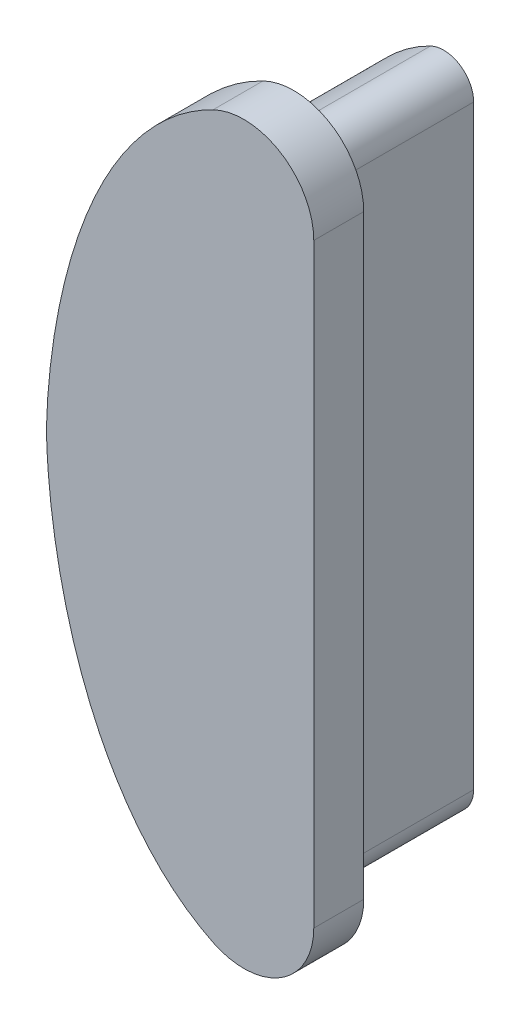
ISO-10303-21;
HEADER;
FILE_DESCRIPTION(('STEP AP214'),'2;1');
FILE_NAME('part.step','',(''),(''),'','','');
FILE_SCHEMA(('AUTOMOTIVE_DESIGN { 1 0 10303 214 1 1 1 1 }'));
ENDSEC;
DATA;
#1=APPLICATION_CONTEXT('core data for automotive mechanical design processes');
#2=APPLICATION_PROTOCOL_DEFINITION('international standard','automotive_design',2000,#1);
#3=PRODUCT_CONTEXT('',#1,'mechanical');
#4=PRODUCT('Part','Part','',(#3));
#5=PRODUCT_RELATED_PRODUCT_CATEGORY('part','',(#4));
#6=PRODUCT_DEFINITION_FORMATION('','',#4);
#7=PRODUCT_DEFINITION_CONTEXT('part definition',#1,'design');
#8=PRODUCT_DEFINITION('design','',#6,#7);
#9=PRODUCT_DEFINITION_SHAPE('','',#8);
#10=(LENGTH_UNIT() NAMED_UNIT(*) SI_UNIT(.MILLI.,.METRE.));
#11=(NAMED_UNIT(*) PLANE_ANGLE_UNIT() SI_UNIT($,.RADIAN.));
#12=(NAMED_UNIT(*) SI_UNIT($,.STERADIAN.) SOLID_ANGLE_UNIT());
#13=UNCERTAINTY_MEASURE_WITH_UNIT(LENGTH_MEASURE(1.E-05),#10,'distance_accuracy_value','');
#14=(GEOMETRIC_REPRESENTATION_CONTEXT(3) GLOBAL_UNCERTAINTY_ASSIGNED_CONTEXT((#13)) GLOBAL_UNIT_ASSIGNED_CONTEXT((#10,
#11,#12)) REPRESENTATION_CONTEXT('',''));
#15=CARTESIAN_POINT('',(0.,0.,0.));
#16=DIRECTION('',(0.,0.,1.));
#17=DIRECTION('',(1.,0.,0.));
#18=AXIS2_PLACEMENT_3D('',#15,#16,#17);
#19=CARTESIAN_POINT('',(-0.938912210717622,-0.460628890981681,3.));
#20=CARTESIAN_POINT('',(-0.930215869974185,-0.813566246949149,3.));
#21=CARTESIAN_POINT('',(-0.882193888673177,-1.50312367914859,3.));
#22=CARTESIAN_POINT('',(-0.647319625173885,-2.99460093175038,3.));
#23=CARTESIAN_POINT('',(-0.0808522255297091,-4.82009209464893,3.));
#24=CARTESIAN_POINT('',(0.89008132531581,-6.26366669180822,3.));
#25=CARTESIAN_POINT('',(1.89349715611541,-6.98605857077607,3.));
#26=CARTESIAN_POINT('',(2.50471800411417,-7.18566243001422,3.));
#27=CARTESIAN_POINT('',(2.81372610105993,-7.2337228856336,3.));
#28=B_SPLINE_CURVE_WITH_KNOTS('',3,(#19,#20,#21,#22,#23,#24,#25,#26,#27),.UNSPECIFIED.,.F.,.F.,
(4,1,1,1,1,1,4),(0.0326750747868868,0.153501113051904,0.274327151316921,0.515979227846955,
0.757631304376989,0.878457342642006,0.999283380907024),.UNSPECIFIED.);
#29=DIRECTION('',(0.,0.,-1.));
#30=VECTOR('',#29,1.);
#31=SURFACE_OF_LINEAR_EXTRUSION('',#28,#30);
#32=CARTESIAN_POINT('',(-0.938912210717622,-0.460628890981681,0.));
#33=CARTESIAN_POINT('',(-0.930215869974185,-0.813566246949149,0.));
#34=CARTESIAN_POINT('',(-0.882193888673177,-1.50312367914859,0.));
#35=CARTESIAN_POINT('',(-0.647319625173885,-2.99460093175038,0.));
#36=CARTESIAN_POINT('',(-0.0808522255297091,-4.82009209464893,0.));
#37=CARTESIAN_POINT('',(0.89008132531581,-6.26366669180822,0.));
#38=CARTESIAN_POINT('',(1.89349715611541,-6.98605857077607,0.));
#39=CARTESIAN_POINT('',(2.50471800411417,-7.18566243001422,0.));
#40=CARTESIAN_POINT('',(2.81372610105993,-7.2337228856336,0.));
#41=B_SPLINE_CURVE_WITH_KNOTS('',3,(#32,#33,#34,#35,#36,#37,#38,#39,#40),.UNSPECIFIED.,.F.,.F.,
(4,1,1,1,1,1,4),(0.0326750747868868,0.153501113051904,0.274327151316921,0.515979227846955,
0.757631304376989,0.878457342642006,0.999283380907024),.UNSPECIFIED.);
#42=CARTESIAN_POINT('',(-0.938912210717622,-0.460628890981681,0.));
#43=VERTEX_POINT('',#42);
#44=CARTESIAN_POINT('',(1.94940692939656,-6.95984878869573,0.));
#45=VERTEX_POINT('',#44);
#46=EDGE_CURVE('E146',#43,#45,#41,.T.);
#47=ORIENTED_EDGE('',*,*,#46,.T.);
#48=DIRECTION('',(0.,0.,-1.));
#49=VECTOR('',#48,1.);
#50=CARTESIAN_POINT('',(1.94940692939656,-6.95984878869573,0.));
#51=LINE('',#50,#49);
#52=CARTESIAN_POINT('',(1.94940692939656,-6.95984878869573,3.));
#53=VERTEX_POINT('',#52);
#54=EDGE_CURVE('E57',#45,#53,#51,.F.);
#55=ORIENTED_EDGE('',*,*,#54,.T.);
#56=CARTESIAN_POINT('',(-0.938912210717622,-0.460628890981681,3.));
#57=VERTEX_POINT('',#56);
#58=EDGE_CURVE('E265',#57,#53,#28,.T.);
#59=ORIENTED_EDGE('',*,*,#58,.F.);
#60=DIRECTION('',(0.,0.,-1.));
#61=VECTOR('',#60,1.);
#62=CARTESIAN_POINT('',(-0.938912210717622,-0.460628890981681,3.));
#63=LINE('',#62,#61);
#64=EDGE_CURVE('E302',#57,#43,#63,.T.);
#65=ORIENTED_EDGE('',*,*,#64,.T.);
#66=EDGE_LOOP('',(#47,#55,#59,#65));
#67=FACE_BOUND('',#66,.T.);
#68=ADVANCED_FACE('F35',(#67),#31,.F.);
#69=CARTESIAN_POINT('',(2.81372610105993,-7.2337228856336,3.));
#70=DIRECTION('',(-1.,0.,0.));
#71=DIRECTION('',(0.,0.,1.));
#72=AXIS2_PLACEMENT_3D('',#69,#70,#71);
#73=PLANE('',#72);
#74=DIRECTION('',(0.,1.,0.));
#75=VECTOR('',#74,1.);
#76=CARTESIAN_POINT('',(2.81372610105993,-7.2337228856336,3.));
#77=LINE('',#76,#75);
#78=CARTESIAN_POINT('',(2.81372610105993,-6.42120662965955,3.));
#79=VERTEX_POINT('',#78);
#80=CARTESIAN_POINT('',(2.81372610105993,5.49994884769618,3.));
#81=VERTEX_POINT('',#80);
#82=EDGE_CURVE('E271',#79,#81,#77,.T.);
#83=ORIENTED_EDGE('',*,*,#82,.F.);
#84=DIRECTION('',(0.,0.,-1.));
#85=VECTOR('',#84,1.);
#86=CARTESIAN_POINT('',(2.81372610105993,-6.42120662965955,3.));
#87=LINE('',#86,#85);
#88=CARTESIAN_POINT('',(2.81372610105993,-6.42120662965955,0.));
#89=VERTEX_POINT('',#88);
#90=EDGE_CURVE('E296',#79,#89,#87,.T.);
#91=ORIENTED_EDGE('',*,*,#90,.T.);
#92=DIRECTION('',(0.,1.,0.));
#93=VECTOR('',#92,1.);
#94=CARTESIAN_POINT('',(2.81372610105993,-7.2337228856336,0.));
#95=LINE('',#94,#93);
#96=CARTESIAN_POINT('',(2.81372610105993,5.49994884769618,0.));
#97=VERTEX_POINT('',#96);
#98=EDGE_CURVE('E148',#89,#97,#95,.T.);
#99=ORIENTED_EDGE('',*,*,#98,.T.);
#100=DIRECTION('',(0.,0.,-1.));
#101=VECTOR('',#100,1.);
#102=CARTESIAN_POINT('',(2.81372610105993,5.49994884769618,3.));
#103=LINE('',#102,#101);
#104=EDGE_CURVE('E305',#97,#81,#103,.F.);
#105=ORIENTED_EDGE('',*,*,#104,.T.);
#106=EDGE_LOOP('',(#83,#91,#99,#105));
#107=FACE_BOUND('',#106,.T.);
#108=ADVANCED_FACE('F280',(#107),#73,.F.);
#109=CARTESIAN_POINT('',(2.81372610105993,6.31246510367024,3.));
#110=CARTESIAN_POINT('',(2.50471800411417,6.26440464805085,3.));
#111=CARTESIAN_POINT('',(1.89349715611541,6.0648007888127,3.));
#112=CARTESIAN_POINT('',(0.89008132531581,5.34240890984486,3.));
#113=CARTESIAN_POINT('',(-0.080852225529709,3.89883431268557,3.));
#114=CARTESIAN_POINT('',(-0.647319625173885,2.07334314978702,3.));
#115=CARTESIAN_POINT('',(-0.882193888673177,0.581865897185233,3.));
#116=CARTESIAN_POINT('',(-0.930215869974185,-0.107691535014213,3.));
#117=CARTESIAN_POINT('',(-0.938912210717622,-0.460628890981681,3.));
#118=B_SPLINE_CURVE_WITH_KNOTS('',3,(#109,#110,#111,#112,#113,#114,#115,#116,#117),
.UNSPECIFIED.,.F.,.F.,(4,1,1,1,1,1,4),(0.0326750747868867,0.153501113051904,0.274327151316921,
0.515979227846955,0.757631304376989,0.878457342642006,0.999283380907024),.UNSPECIFIED.);
#119=DIRECTION('',(0.,0.,-1.));
#120=VECTOR('',#119,1.);
#121=SURFACE_OF_LINEAR_EXTRUSION('',#118,#120);
#122=CARTESIAN_POINT('',(1.9494069293965,6.03859100673233,3.));
#123=VERTEX_POINT('',#122);
#124=EDGE_CURVE('E49',#123,#57,#118,.T.);
#125=ORIENTED_EDGE('',*,*,#124,.F.);
#126=DIRECTION('',(0.,0.,-1.));
#127=VECTOR('',#126,1.);
#128=CARTESIAN_POINT('',(1.9494069293965,6.03859100673233,3.));
#129=LINE('',#128,#127);
#130=CARTESIAN_POINT('',(1.9494069293965,6.03859100673233,0.));
#131=VERTEX_POINT('',#130);
#132=EDGE_CURVE('E11',#123,#131,#129,.T.);
#133=ORIENTED_EDGE('',*,*,#132,.T.);
#134=CARTESIAN_POINT('',(2.81372610105993,6.31246510367024,0.));
#135=CARTESIAN_POINT('',(2.50471800411417,6.26440464805085,0.));
#136=CARTESIAN_POINT('',(1.89349715611541,6.0648007888127,0.));
#137=CARTESIAN_POINT('',(0.89008132531581,5.34240890984486,0.));
#138=CARTESIAN_POINT('',(-0.080852225529709,3.89883431268557,0.));
#139=CARTESIAN_POINT('',(-0.647319625173885,2.07334314978702,0.));
#140=CARTESIAN_POINT('',(-0.882193888673177,0.581865897185233,0.));
#141=CARTESIAN_POINT('',(-0.930215869974185,-0.107691535014213,0.));
#142=CARTESIAN_POINT('',(-0.938912210717622,-0.460628890981681,0.));
#143=B_SPLINE_CURVE_WITH_KNOTS('',3,(#134,#135,#136,#137,#138,#139,#140,#141,#142),
.UNSPECIFIED.,.F.,.F.,(4,1,1,1,1,1,4),(0.0326750747868867,0.153501113051904,0.274327151316921,
0.515979227846955,0.757631304376989,0.878457342642006,0.999283380907024),.UNSPECIFIED.);
#144=EDGE_CURVE('E272',#131,#43,#143,.T.);
#145=ORIENTED_EDGE('',*,*,#144,.T.);
#146=ORIENTED_EDGE('',*,*,#64,.F.);
#147=EDGE_LOOP('',(#125,#133,#145,#146));
#148=FACE_BOUND('',#147,.T.);
#149=ADVANCED_FACE('F291',(#148),#121,.F.);
#150=CARTESIAN_POINT('',(4.10047105600136E-05,-4.74370878150108,0.));
#151=DIRECTION('',(0.,0.,-1.));
#152=DIRECTION('',(-1.,0.,0.));
#153=AXIS2_PLACEMENT_3D('',#150,#151,#152);
#154=PLANE('',#153);
#155=ORIENTED_EDGE('',*,*,#98,.F.);
#156=CARTESIAN_POINT('',(2.21372610106005,-6.42120662965955,0.));
#157=DIRECTION('',(0.,0.,-1.));
#158=DIRECTION('',(-1.,0.,0.));
#159=AXIS2_PLACEMENT_3D('',#156,#157,#158);
#160=CIRCLE('',#159,0.6);
#161=EDGE_CURVE('E316',#89,#45,#160,.T.);
#162=ORIENTED_EDGE('',*,*,#161,.T.);
#163=ORIENTED_EDGE('',*,*,#46,.F.);
#164=ORIENTED_EDGE('',*,*,#144,.F.);
#165=CARTESIAN_POINT('',(2.21372610105999,5.49994884769618,0.));
#166=DIRECTION('',(0.,0.,-1.));
#167=DIRECTION('',(-1.,0.,0.));
#168=AXIS2_PLACEMENT_3D('',#165,#166,#167);
#169=CIRCLE('',#168,0.6);
#170=EDGE_CURVE('E314',#131,#97,#169,.T.);
#171=ORIENTED_EDGE('',*,*,#170,.T.);
#172=EDGE_LOOP('',(#155,#162,#163,#164,#171));
#173=FACE_BOUND('',#172,.T.);
#174=ADVANCED_FACE('F284',(#173),#154,.T.);
#175=CARTESIAN_POINT('',(2.21372610106005,-6.42120662965955,1.5));
#176=DIRECTION('',(0.,0.,-1.));
#177=DIRECTION('',(-1.,0.,0.));
#178=AXIS2_PLACEMENT_3D('',#175,#176,#177);
#179=CYLINDRICAL_SURFACE('',#178,0.6);
#180=CARTESIAN_POINT('',(2.21372610106005,-6.42120662965955,3.));
#181=DIRECTION('',(0.,0.,-1.));
#182=DIRECTION('',(-1.,0.,0.));
#183=AXIS2_PLACEMENT_3D('',#180,#181,#182);
#184=CIRCLE('',#183,0.6);
#185=EDGE_CURVE('E43',#53,#79,#184,.F.);
#186=ORIENTED_EDGE('',*,*,#185,.F.);
#187=ORIENTED_EDGE('',*,*,#54,.F.);
#188=ORIENTED_EDGE('',*,*,#161,.F.);
#189=ORIENTED_EDGE('',*,*,#90,.F.);
#190=EDGE_LOOP('',(#186,#187,#188,#189));
#191=FACE_BOUND('',#190,.T.);
#192=ADVANCED_FACE('F282',(#191),#179,.T.);
#193=CARTESIAN_POINT('',(2.21372610105999,5.49994884769618,1.5));
#194=DIRECTION('',(0.,0.,-1.));
#195=DIRECTION('',(-1.,0.,0.));
#196=AXIS2_PLACEMENT_3D('',#193,#194,#195);
#197=CYLINDRICAL_SURFACE('',#196,0.6);
#198=CARTESIAN_POINT('',(2.21372610105999,5.49994884769618,3.));
#199=DIRECTION('',(0.,0.,-1.));
#200=DIRECTION('',(-1.,0.,0.));
#201=AXIS2_PLACEMENT_3D('',#198,#199,#200);
#202=CIRCLE('',#201,0.6);
#203=EDGE_CURVE('E299',#81,#123,#202,.F.);
#204=ORIENTED_EDGE('',*,*,#203,.F.);
#205=ORIENTED_EDGE('',*,*,#104,.F.);
#206=ORIENTED_EDGE('',*,*,#170,.F.);
#207=ORIENTED_EDGE('',*,*,#132,.F.);
#208=EDGE_LOOP('',(#204,#205,#206,#207));
#209=FACE_BOUND('',#208,.T.);
#210=ADVANCED_FACE('F37',(#209),#197,.T.);
#211=CARTESIAN_POINT('',(1.59698136717853,6.75678055211384,4.));
#212=CARTESIAN_POINT('',(1.28206176202311,6.60224513787106,4.));
#213=CARTESIAN_POINT('',(0.994843741393202,6.40713564544012,4.));
#214=CARTESIAN_POINT('',(0.467503364348097,5.94793637678211,4.));
#215=CARTESIAN_POINT('',(0.233787218104545,5.69040011793546,4.));
#216=CARTESIAN_POINT('',(-0.184066223507001,5.14061817776625,4.));
#217=CARTESIAN_POINT('',(-0.370152573976016,4.84527014812926,4.));
#218=CARTESIAN_POINT('',(-0.699300989325908,4.23283337494818,4.));
#219=CARTESIAN_POINT('',(-0.841194277304251,3.91834030463301,4.));
#220=CARTESIAN_POINT('',(-1.08985728586109,3.27654002703633,4.));
#221=CARTESIAN_POINT('',(-1.19661075310595,2.9492268900484,4.));
#222=CARTESIAN_POINT('',(-1.38071085024028,2.28387211468403,4.));
#223=CARTESIAN_POINT('',(-1.45816317854415,1.9447137117851,4.));
#224=CARTESIAN_POINT('',(-1.64874703473297,0.922143409252922,4.));
#225=CARTESIAN_POINT('',(-1.72203755798871,0.234076304266433,4.));
#226=CARTESIAN_POINT('',(-1.73915502371447,-0.460628890981681,4.));
#227=B_SPLINE_CURVE_WITH_KNOTS('',3,(#211,#212,#213,#214,#215,#216,#217,#218,#219,#220,#221,
#222,#223,#224,#225,#226),.UNSPECIFIED.,.F.,.F.,(4,2,2,2,2,2,2,4),(0.,0.125,0.25,0.375,0.5,
0.625,0.75,1.),.UNSPECIFIED.);
#228=DIRECTION('',(0.,0.,-1.));
#229=VECTOR('',#228,1.);
#230=SURFACE_OF_LINEAR_EXTRUSION('',#227,#229);
#231=CARTESIAN_POINT('',(1.59698136717853,6.75678055211384,3.));
#232=CARTESIAN_POINT('',(1.28206176202311,6.60224513787106,3.));
#233=CARTESIAN_POINT('',(0.994843741393202,6.40713564544012,3.));
#234=CARTESIAN_POINT('',(0.467503364348097,5.94793637678211,3.));
#235=CARTESIAN_POINT('',(0.233787218104545,5.69040011793546,3.));
#236=CARTESIAN_POINT('',(-0.184066223507001,5.14061817776625,3.));
#237=CARTESIAN_POINT('',(-0.370152573976016,4.84527014812926,3.));
#238=CARTESIAN_POINT('',(-0.699300989325908,4.23283337494818,3.));
#239=CARTESIAN_POINT('',(-0.841194277304251,3.91834030463301,3.));
#240=CARTESIAN_POINT('',(-1.08985728586109,3.27654002703633,3.));
#241=CARTESIAN_POINT('',(-1.19661075310595,2.9492268900484,3.));
#242=CARTESIAN_POINT('',(-1.38071085024028,2.28387211468403,3.));
#243=CARTESIAN_POINT('',(-1.45816317854415,1.9447137117851,3.));
#244=CARTESIAN_POINT('',(-1.64874703473297,0.922143409252922,3.));
#245=CARTESIAN_POINT('',(-1.72203755798871,0.234076304266433,3.));
#246=CARTESIAN_POINT('',(-1.73915502371447,-0.460628890981681,3.));
#247=B_SPLINE_CURVE_WITH_KNOTS('',3,(#231,#232,#233,#234,#235,#236,#237,#238,#239,#240,#241,
#242,#243,#244,#245,#246),.UNSPECIFIED.,.F.,.F.,(4,2,2,2,2,2,2,4),(0.,0.125,0.25,0.375,0.5,
0.625,0.75,1.),.UNSPECIFIED.);
#248=CARTESIAN_POINT('',(1.59698136717853,6.75678055211382,3.));
#249=VERTEX_POINT('',#248);
#250=CARTESIAN_POINT('',(-1.73915502371447,-0.460628890981681,3.));
#251=VERTEX_POINT('',#250);
#252=EDGE_CURVE('E144',#249,#251,#247,.T.);
#253=ORIENTED_EDGE('',*,*,#252,.T.);
#254=DIRECTION('',(0.,0.,-1.));
#255=VECTOR('',#254,1.);
#256=CARTESIAN_POINT('',(-1.73915502371447,-0.460628890981681,4.));
#257=LINE('',#256,#255);
#258=CARTESIAN_POINT('',(-1.73915502371447,-0.460628890981681,4.));
#259=VERTEX_POINT('',#258);
#260=EDGE_CURVE('E119',#259,#251,#257,.T.);
#261=ORIENTED_EDGE('',*,*,#260,.F.);
#262=CARTESIAN_POINT('',(-1.73915502371447,-0.460628890981681,4.));
#263=CARTESIAN_POINT('',(-1.72203755798871,0.234076304266433,4.));
#264=CARTESIAN_POINT('',(-1.64874703473297,0.922143409252922,4.));
#265=CARTESIAN_POINT('',(-1.45816317854415,1.9447137117851,4.));
#266=CARTESIAN_POINT('',(-1.38071085024028,2.28387211468403,4.));
#267=CARTESIAN_POINT('',(-1.19661075310595,2.9492268900484,4.));
#268=CARTESIAN_POINT('',(-1.08985728586109,3.27654002703633,4.));
#269=CARTESIAN_POINT('',(-0.841194277304251,3.91834030463301,4.));
#270=CARTESIAN_POINT('',(-0.699300989325908,4.23283337494818,4.));
#271=CARTESIAN_POINT('',(-0.370152573976016,4.84527014812926,4.));
#272=CARTESIAN_POINT('',(-0.184066223507001,5.14061817776625,4.));
#273=CARTESIAN_POINT('',(0.233787218104545,5.69040011793546,4.));
#274=CARTESIAN_POINT('',(0.467503364348097,5.94793637678211,4.));
#275=CARTESIAN_POINT('',(0.994843741393202,6.40713564544012,4.));
#276=CARTESIAN_POINT('',(1.28206176202311,6.60224513787106,4.));
#277=CARTESIAN_POINT('',(1.59698136717853,6.75678055211384,4.));
#278=B_SPLINE_CURVE_WITH_KNOTS('',3,(#262,#263,#264,#265,#266,#267,#268,#269,#270,#271,#272,
#273,#274,#275,#276,#277),.UNSPECIFIED.,.F.,.F.,(4,2,2,2,2,2,2,4),(0.,0.25,0.375,0.5,0.625,0.75,
0.875,1.),.UNSPECIFIED.);
#279=CARTESIAN_POINT('',(1.59698136717853,6.75678055211382,4.));
#280=VERTEX_POINT('',#279);
#281=EDGE_CURVE('E127',#280,#259,#278,.F.);
#282=ORIENTED_EDGE('',*,*,#281,.F.);
#283=DIRECTION('',(0.,0.,-1.));
#284=VECTOR('',#283,1.);
#285=CARTESIAN_POINT('',(1.59698136717853,6.75678055211382,4.));
#286=LINE('',#285,#284);
#287=EDGE_CURVE('E203',#280,#249,#286,.T.);
#288=ORIENTED_EDGE('',*,*,#287,.T.);
#289=EDGE_LOOP('',(#253,#261,#282,#288));
#290=FACE_BOUND('',#289,.T.);
#291=ADVANCED_FACE('F142',(#290),#230,.F.);
#292=CARTESIAN_POINT('',(-1.73915502371447,-0.460628890981681,4.));
#293=CARTESIAN_POINT('',(-1.72203627169885,-1.15538628976636,4.));
#294=CARTESIAN_POINT('',(-1.64874297364986,-1.84324582986891,4.));
#295=CARTESIAN_POINT('',(-1.45833205683048,-2.86515384294929,4.));
#296=CARTESIAN_POINT('',(-1.38079382697728,-3.20477496342549,4.));
#297=CARTESIAN_POINT('',(-1.19678484278644,-3.86991046658444,4.));
#298=CARTESIAN_POINT('',(-0.983662470004055,-4.52326445701269,4.));
#299=CARTESIAN_POINT('',(-0.701707089934085,-5.14876332679485,4.));
#300=CARTESIAN_POINT('',(-0.375964944438823,-5.75654270876575,4.));
#301=CARTESIAN_POINT('',(-0.189209114177491,-6.05447331207561,4.));
#302=CARTESIAN_POINT('',(0.231167862796688,-6.60883590340507,4.));
#303=CARTESIAN_POINT('',(0.464059519577493,-6.86563861312892,4.));
#304=CARTESIAN_POINT('',(0.858736470779852,-7.21014552949839,4.));
#305=CARTESIAN_POINT('',(0.99817121196507,-7.31798073500881,4.));
#306=CARTESIAN_POINT('',(1.28806801673091,-7.51288995776142,4.));
#307=CARTESIAN_POINT('',(1.43922648706688,-7.60062582832091,4.));
#308=CARTESIAN_POINT('',(1.59698136717855,-7.67803833407725,4.));
#309=B_SPLINE_CURVE_WITH_KNOTS('',3,(#292,#293,#294,#295,#296,#297,#298,#299,#300,#301,#302,
#303,#304,#305,#306,#307,#308),.UNSPECIFIED.,.F.,.F.,(4,2,2,1,2,2,2,2,4),(0.,0.25,0.375,0.5,
0.625,0.75,0.875,0.9375,1.),.UNSPECIFIED.);
#310=DIRECTION('',(0.,0.,-1.));
#311=VECTOR('',#310,1.);
#312=SURFACE_OF_LINEAR_EXTRUSION('',#309,#311);
#313=CARTESIAN_POINT('',(-1.73915502371447,-0.460628890981681,3.));
#314=CARTESIAN_POINT('',(-1.72203627169885,-1.15538628976636,3.));
#315=CARTESIAN_POINT('',(-1.64874297364986,-1.84324582986891,3.));
#316=CARTESIAN_POINT('',(-1.45833205683048,-2.86515384294929,3.));
#317=CARTESIAN_POINT('',(-1.38079382697728,-3.20477496342549,3.));
#318=CARTESIAN_POINT('',(-1.19678484278644,-3.86991046658444,3.));
#319=CARTESIAN_POINT('',(-0.983662470004055,-4.52326445701269,3.));
#320=CARTESIAN_POINT('',(-0.701707089934085,-5.14876332679485,3.));
#321=CARTESIAN_POINT('',(-0.375964944438823,-5.75654270876575,3.));
#322=CARTESIAN_POINT('',(-0.189209114177491,-6.05447331207561,3.));
#323=CARTESIAN_POINT('',(0.231167862796688,-6.60883590340507,3.));
#324=CARTESIAN_POINT('',(0.464059519577493,-6.86563861312892,3.));
#325=CARTESIAN_POINT('',(0.858736470779852,-7.21014552949839,3.));
#326=CARTESIAN_POINT('',(0.99817121196507,-7.31798073500881,3.));
#327=CARTESIAN_POINT('',(1.28806801673091,-7.51288995776142,3.));
#328=CARTESIAN_POINT('',(1.43922648706688,-7.60062582832091,3.));
#329=CARTESIAN_POINT('',(1.59698136717855,-7.67803833407725,3.));
#330=B_SPLINE_CURVE_WITH_KNOTS('',3,(#313,#314,#315,#316,#317,#318,#319,#320,#321,#322,#323,
#324,#325,#326,#327,#328,#329),.UNSPECIFIED.,.F.,.F.,(4,2,2,1,2,2,2,2,4),(0.,0.25,0.375,0.5,
0.625,0.75,0.875,0.9375,1.),.UNSPECIFIED.);
#331=CARTESIAN_POINT('',(1.59698136717855,-7.67803833407725,3.));
#332=VERTEX_POINT('',#331);
#333=EDGE_CURVE('E165',#251,#332,#330,.T.);
#334=ORIENTED_EDGE('',*,*,#333,.T.);
#335=DIRECTION('',(0.,0.,-1.));
#336=VECTOR('',#335,1.);
#337=CARTESIAN_POINT('',(1.59698136717855,-7.67803833407725,4.));
#338=LINE('',#337,#336);
#339=CARTESIAN_POINT('',(1.59698136717855,-7.67803833407725,4.));
#340=VERTEX_POINT('',#339);
#341=EDGE_CURVE('E122',#340,#332,#338,.T.);
#342=ORIENTED_EDGE('',*,*,#341,.F.);
#343=CARTESIAN_POINT('',(1.59698136717855,-7.67803833407725,4.));
#344=CARTESIAN_POINT('',(1.43922648706688,-7.60062582832091,4.));
#345=CARTESIAN_POINT('',(1.28806801673091,-7.51288995776142,4.));
#346=CARTESIAN_POINT('',(0.99817121196507,-7.31798073500881,4.));
#347=CARTESIAN_POINT('',(0.858736470779852,-7.21014552949839,4.));
#348=CARTESIAN_POINT('',(0.464059519577493,-6.86563861312892,4.));
#349=CARTESIAN_POINT('',(0.231167862796688,-6.60883590340507,4.));
#350=CARTESIAN_POINT('',(-0.189209114177491,-6.05447331207561,4.));
#351=CARTESIAN_POINT('',(-0.375964944438823,-5.75654270876575,4.));
#352=CARTESIAN_POINT('',(-0.701707089934085,-5.14876332679485,4.));
#353=CARTESIAN_POINT('',(-0.983662470004055,-4.52326445701269,4.));
#354=CARTESIAN_POINT('',(-1.19678484278644,-3.86991046658444,4.));
#355=CARTESIAN_POINT('',(-1.38079382697728,-3.20477496342549,4.));
#356=CARTESIAN_POINT('',(-1.45833205683048,-2.86515384294929,4.));
#357=CARTESIAN_POINT('',(-1.64874297364986,-1.84324582986891,4.));
#358=CARTESIAN_POINT('',(-1.72203627169885,-1.15538628976636,4.));
#359=CARTESIAN_POINT('',(-1.73915502371447,-0.460628890981681,4.));
#360=B_SPLINE_CURVE_WITH_KNOTS('',3,(#343,#344,#345,#346,#347,#348,#349,#350,#351,#352,#353,
#354,#355,#356,#357,#358,#359),.UNSPECIFIED.,.F.,.F.,(4,2,2,2,2,1,2,2,4),(0.,0.0625,0.125,0.25,
0.375,0.5,0.625,0.75,1.),.UNSPECIFIED.);
#361=EDGE_CURVE('E114',#259,#340,#360,.F.);
#362=ORIENTED_EDGE('',*,*,#361,.F.);
#363=ORIENTED_EDGE('',*,*,#260,.T.);
#364=EDGE_LOOP('',(#334,#342,#362,#363));
#365=FACE_BOUND('',#364,.T.);
#366=ADVANCED_FACE('F117',(#365),#312,.F.);
#367=CARTESIAN_POINT('',(2.21372610106005,-6.42120662965955,4.));
#368=DIRECTION('',(0.,0.,-1.));
#369=DIRECTION('',(-1.,0.,0.));
#370=AXIS2_PLACEMENT_3D('',#367,#368,#369);
#371=CYLINDRICAL_SURFACE('',#370,1.39999999999999);
#372=CARTESIAN_POINT('',(2.21372610106005,-6.42120662965955,3.));
#373=DIRECTION('',(0.,0.,1.));
#374=DIRECTION('',(1.,0.,0.));
#375=AXIS2_PLACEMENT_3D('',#372,#373,#374);
#376=CIRCLE('',#375,1.39999999999999);
#377=CARTESIAN_POINT('',(3.61372610106004,-6.42120662965955,3.));
#378=VERTEX_POINT('',#377);
#379=EDGE_CURVE('E199',#332,#378,#376,.T.);
#380=ORIENTED_EDGE('',*,*,#379,.T.);
#381=DIRECTION('',(0.,0.,-1.));
#382=VECTOR('',#381,1.);
#383=CARTESIAN_POINT('',(3.61372610106004,-6.42120662965955,4.));
#384=LINE('',#383,#382);
#385=CARTESIAN_POINT('',(3.61372610106004,-6.42120662965955,4.));
#386=VERTEX_POINT('',#385);
#387=EDGE_CURVE('E150',#386,#378,#384,.T.);
#388=ORIENTED_EDGE('',*,*,#387,.F.);
#389=CARTESIAN_POINT('',(2.21372610106005,-6.42120662965955,4.));
#390=DIRECTION('',(0.,0.,1.));
#391=DIRECTION('',(1.,0.,0.));
#392=AXIS2_PLACEMENT_3D('',#389,#390,#391);
#393=CIRCLE('',#392,1.39999999999999);
#394=EDGE_CURVE('E126',#340,#386,#393,.T.);
#395=ORIENTED_EDGE('',*,*,#394,.F.);
#396=ORIENTED_EDGE('',*,*,#341,.T.);
#397=EDGE_LOOP('',(#380,#388,#395,#396));
#398=FACE_BOUND('',#397,.T.);
#399=ADVANCED_FACE('F180',(#398),#371,.T.);
#400=CARTESIAN_POINT('',(3.61372610106001,-6.42120662965955,4.));
#401=DIRECTION('',(-1.,0.,0.));
#402=DIRECTION('',(0.,-1.,0.));
#403=AXIS2_PLACEMENT_3D('',#400,#401,#402);
#404=PLANE('',#403);
#405=DIRECTION('',(0.,1.,0.));
#406=VECTOR('',#405,1.);
#407=CARTESIAN_POINT('',(3.61372610106001,-6.42120662965955,3.));
#408=LINE('',#407,#406);
#409=CARTESIAN_POINT('',(3.61372610105993,5.49994884769618,3.));
#410=VERTEX_POINT('',#409);
#411=EDGE_CURVE('E197',#378,#410,#408,.T.);
#412=ORIENTED_EDGE('',*,*,#411,.T.);
#413=DIRECTION('',(0.,0.,-1.));
#414=VECTOR('',#413,1.);
#415=CARTESIAN_POINT('',(3.61372610105993,5.49994884769618,4.));
#416=LINE('',#415,#414);
#417=CARTESIAN_POINT('',(3.61372610105993,5.49994884769618,4.));
#418=VERTEX_POINT('',#417);
#419=EDGE_CURVE('E200',#418,#410,#416,.T.);
#420=ORIENTED_EDGE('',*,*,#419,.F.);
#421=DIRECTION('',(0.,1.,0.));
#422=VECTOR('',#421,1.);
#423=CARTESIAN_POINT('',(3.61372610106001,-6.42120662965955,4.));
#424=LINE('',#423,#422);
#425=EDGE_CURVE('E161',#386,#418,#424,.T.);
#426=ORIENTED_EDGE('',*,*,#425,.F.);
#427=ORIENTED_EDGE('',*,*,#387,.T.);
#428=EDGE_LOOP('',(#412,#420,#426,#427));
#429=FACE_BOUND('',#428,.T.);
#430=ADVANCED_FACE('F384',(#429),#404,.F.);
#431=CARTESIAN_POINT('',(2.21372610105999,5.49994884769618,4.));
#432=DIRECTION('',(0.,0.,-1.));
#433=DIRECTION('',(-1.,0.,0.));
#434=AXIS2_PLACEMENT_3D('',#431,#432,#433);
#435=CYLINDRICAL_SURFACE('',#434,1.39999999999995);
#436=CARTESIAN_POINT('',(2.21372610105999,5.49994884769618,3.));
#437=DIRECTION('',(0.,0.,1.));
#438=DIRECTION('',(1.,0.,0.));
#439=AXIS2_PLACEMENT_3D('',#436,#437,#438);
#440=CIRCLE('',#439,1.39999999999995);
#441=EDGE_CURVE('E139',#410,#249,#440,.T.);
#442=ORIENTED_EDGE('',*,*,#441,.T.);
#443=ORIENTED_EDGE('',*,*,#287,.F.);
#444=CARTESIAN_POINT('',(2.21372610105999,5.49994884769618,4.));
#445=DIRECTION('',(0.,0.,1.));
#446=DIRECTION('',(1.,0.,0.));
#447=AXIS2_PLACEMENT_3D('',#444,#445,#446);
#448=CIRCLE('',#447,1.39999999999995);
#449=EDGE_CURVE('E134',#418,#280,#448,.T.);
#450=ORIENTED_EDGE('',*,*,#449,.F.);
#451=ORIENTED_EDGE('',*,*,#419,.T.);
#452=EDGE_LOOP('',(#442,#443,#450,#451));
#453=FACE_BOUND('',#452,.T.);
#454=ADVANCED_FACE('F217',(#453),#435,.T.);
#455=CARTESIAN_POINT('',(-0.965525781582671,3.59744016583467,4.));
#456=DIRECTION('',(0.,0.,-1.));
#457=DIRECTION('',(-1.,0.,0.));
#458=AXIS2_PLACEMENT_3D('',#455,#456,#457);
#459=PLANE('',#458);
#460=ORIENTED_EDGE('',*,*,#281,.T.);
#461=ORIENTED_EDGE('',*,*,#361,.T.);
#462=ORIENTED_EDGE('',*,*,#394,.T.);
#463=ORIENTED_EDGE('',*,*,#425,.T.);
#464=ORIENTED_EDGE('',*,*,#449,.T.);
#465=EDGE_LOOP('',(#460,#461,#462,#463,#464));
#466=FACE_BOUND('',#465,.T.);
#467=ADVANCED_FACE('F132',(#466),#459,.F.);
#468=CARTESIAN_POINT('',(-0.965525781582671,3.59744016583467,3.));
#469=DIRECTION('',(0.,0.,-1.));
#470=DIRECTION('',(-1.,0.,0.));
#471=AXIS2_PLACEMENT_3D('',#468,#469,#470);
#472=PLANE('',#471);
#473=ORIENTED_EDGE('',*,*,#124,.T.);
#474=ORIENTED_EDGE('',*,*,#58,.T.);
#475=ORIENTED_EDGE('',*,*,#185,.T.);
#476=ORIENTED_EDGE('',*,*,#82,.T.);
#477=ORIENTED_EDGE('',*,*,#203,.T.);
#478=EDGE_LOOP('',(#473,#474,#475,#476,#477));
#479=FACE_BOUND('',#478,.T.);
#480=ORIENTED_EDGE('',*,*,#252,.F.);
#481=ORIENTED_EDGE('',*,*,#441,.F.);
#482=ORIENTED_EDGE('',*,*,#411,.F.);
#483=ORIENTED_EDGE('',*,*,#379,.F.);
#484=ORIENTED_EDGE('',*,*,#333,.F.);
#485=EDGE_LOOP('',(#480,#481,#482,#483,#484));
#486=FACE_BOUND('',#485,.T.);
#487=ADVANCED_FACE('F216',(#479,#486),#472,.T.);
#488=CLOSED_SHELL('',(#68,#108,#149,#174,#192,#210,#291,#366,#399,#430,#454,#467,#487));
#489=MANIFOLD_SOLID_BREP('B2',#488);
#490=ADVANCED_BREP_SHAPE_REPRESENTATION('',(#18,#489),#14);
#491=SHAPE_DEFINITION_REPRESENTATION(#9,#490);
ENDSEC;
END-ISO-10303-21;
